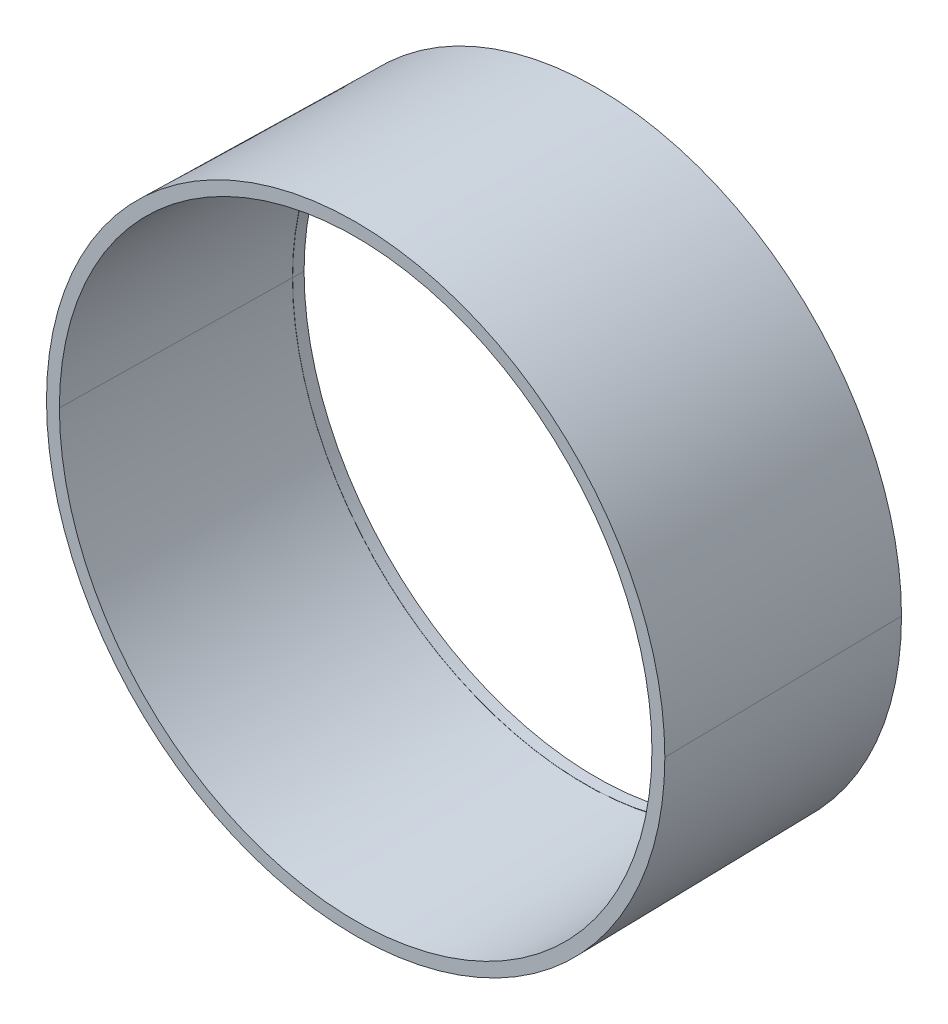
ISO-10303-21;
HEADER;
FILE_DESCRIPTION(('STEP AP214'),'2;1');
FILE_NAME('part.step','',(''),(''),'','','');
FILE_SCHEMA(('AUTOMOTIVE_DESIGN { 1 0 10303 214 1 1 1 1 }'));
ENDSEC;
DATA;
#1=APPLICATION_CONTEXT('core data for automotive mechanical design processes');
#2=APPLICATION_PROTOCOL_DEFINITION('international standard','automotive_design',2000,#1);
#3=PRODUCT_CONTEXT('',#1,'mechanical');
#4=PRODUCT('Part','Part','',(#3));
#5=PRODUCT_RELATED_PRODUCT_CATEGORY('part','',(#4));
#6=PRODUCT_DEFINITION_FORMATION('','',#4);
#7=PRODUCT_DEFINITION_CONTEXT('part definition',#1,'design');
#8=PRODUCT_DEFINITION('design','',#6,#7);
#9=PRODUCT_DEFINITION_SHAPE('','',#8);
#10=(LENGTH_UNIT() NAMED_UNIT(*) SI_UNIT(.MILLI.,.METRE.));
#11=(NAMED_UNIT(*) PLANE_ANGLE_UNIT() SI_UNIT($,.RADIAN.));
#12=(NAMED_UNIT(*) SI_UNIT($,.STERADIAN.) SOLID_ANGLE_UNIT());
#13=UNCERTAINTY_MEASURE_WITH_UNIT(LENGTH_MEASURE(1.E-05),#10,'distance_accuracy_value','');
#14=(GEOMETRIC_REPRESENTATION_CONTEXT(3) GLOBAL_UNCERTAINTY_ASSIGNED_CONTEXT((#13)) GLOBAL_UNIT_ASSIGNED_CONTEXT((#10,
#11,#12)) REPRESENTATION_CONTEXT('',''));
#15=CARTESIAN_POINT('',(0.,0.,0.));
#16=DIRECTION('',(0.,0.,1.));
#17=DIRECTION('',(1.,0.,0.));
#18=AXIS2_PLACEMENT_3D('',#15,#16,#17);
#19=CARTESIAN_POINT('',(0.,0.,-39.9));
#20=DIRECTION('',(0.,0.,-1.));
#21=DIRECTION('',(1.,0.,0.));
#22=AXIS2_PLACEMENT_3D('',#19,#20,#21);
#23=CYLINDRICAL_SURFACE('',#22,51.);
#24=DIRECTION('',(0.,0.,-1.));
#25=VECTOR('',#24,1.);
#26=CARTESIAN_POINT('',(-51.,0.,-40.));
#27=LINE('',#26,#25);
#28=CARTESIAN_POINT('',(-51.,0.,-40.));
#29=VERTEX_POINT('',#28);
#30=CARTESIAN_POINT('',(-51.,0.,-42.));
#31=VERTEX_POINT('',#30);
#32=EDGE_CURVE('E79',#29,#31,#27,.T.);
#33=ORIENTED_EDGE('',*,*,#32,.F.);
#34=CARTESIAN_POINT('',(0.,0.,-40.));
#35=DIRECTION('',(0.,0.,1.));
#36=DIRECTION('',(-1.,0.,0.));
#37=AXIS2_PLACEMENT_3D('',#34,#35,#36);
#38=CIRCLE('',#37,51.);
#39=CARTESIAN_POINT('',(51.,0.,-40.));
#40=VERTEX_POINT('',#39);
#41=EDGE_CURVE('E107',#29,#40,#38,.T.);
#42=ORIENTED_EDGE('',*,*,#41,.T.);
#43=DIRECTION('',(0.,0.,-1.));
#44=VECTOR('',#43,1.);
#45=CARTESIAN_POINT('',(51.,0.,-40.));
#46=LINE('',#45,#44);
#47=CARTESIAN_POINT('',(51.,0.,-42.));
#48=VERTEX_POINT('',#47);
#49=EDGE_CURVE('E136',#40,#48,#46,.T.);
#50=ORIENTED_EDGE('',*,*,#49,.T.);
#51=CARTESIAN_POINT('',(0.,0.,-42.));
#52=DIRECTION('',(0.,0.,-1.));
#53=DIRECTION('',(1.,0.,0.));
#54=AXIS2_PLACEMENT_3D('',#51,#52,#53);
#55=CIRCLE('',#54,51.);
#56=EDGE_CURVE('E137',#48,#31,#55,.T.);
#57=ORIENTED_EDGE('',*,*,#56,.T.);
#58=EDGE_LOOP('',(#33,#42,#50,#57));
#59=FACE_BOUND('',#58,.T.);
#60=ADVANCED_FACE('F16',(#59),#23,.F.);
#61=CARTESIAN_POINT('',(0.,0.,-20.));
#62=DIRECTION('',(0.,0.,1.));
#63=DIRECTION('',(-1.,0.,0.));
#64=AXIS2_PLACEMENT_3D('',#61,#62,#63);
#65=CONICAL_SURFACE('',#64,51.36666666667,0.016665123713937);
#66=DIRECTION('',(0.01666435233399,0.,-0.9998611400396));
#67=VECTOR('',#66,1.);
#68=CARTESIAN_POINT('',(-51.7,0.,0.));
#69=LINE('',#68,#67);
#70=CARTESIAN_POINT('',(-51.7,0.,-1.367407764635E-12));
#71=VERTEX_POINT('',#70);
#72=CARTESIAN_POINT('',(-51.03333333333,0.,-40.));
#73=VERTEX_POINT('',#72);
#74=EDGE_CURVE('E114',#71,#73,#69,.T.);
#75=ORIENTED_EDGE('',*,*,#74,.F.);
#76=CARTESIAN_POINT('',(0.,0.,-1.364242052659E-12));
#77=DIRECTION('',(0.,0.,1.));
#78=DIRECTION('',(-1.,0.,0.));
#79=AXIS2_PLACEMENT_3D('',#76,#77,#78);
#80=CIRCLE('',#79,51.7);
#81=CARTESIAN_POINT('',(51.7,0.,-1.361076340684E-12));
#82=VERTEX_POINT('',#81);
#83=EDGE_CURVE('E11',#71,#82,#80,.T.);
#84=ORIENTED_EDGE('',*,*,#83,.T.);
#85=DIRECTION('',(-0.01666435233399,0.,-0.9998611400396));
#86=VECTOR('',#85,1.);
#87=CARTESIAN_POINT('',(51.7,0.,0.));
#88=LINE('',#87,#86);
#89=CARTESIAN_POINT('',(51.03333333333,0.,-40.));
#90=VERTEX_POINT('',#89);
#91=EDGE_CURVE('E113',#82,#90,#88,.T.);
#92=ORIENTED_EDGE('',*,*,#91,.T.);
#93=CARTESIAN_POINT('',(0.,0.,-40.));
#94=DIRECTION('',(0.,0.,-1.));
#95=DIRECTION('',(1.,0.,0.));
#96=AXIS2_PLACEMENT_3D('',#93,#94,#95);
#97=CIRCLE('',#96,51.03333333333);
#98=EDGE_CURVE('E91',#90,#73,#97,.T.);
#99=ORIENTED_EDGE('',*,*,#98,.T.);
#100=EDGE_LOOP('',(#75,#84,#92,#99));
#101=FACE_BOUND('',#100,.T.);
#102=ADVANCED_FACE('F117',(#101),#65,.F.);
#103=CARTESIAN_POINT('',(0.,0.,0.));
#104=DIRECTION('',(0.,0.,-1.));
#105=DIRECTION('',(0.,-1.,0.));
#106=AXIS2_PLACEMENT_3D('',#103,#104,#105);
#107=PLANE('',#106);
#108=ORIENTED_EDGE('',*,*,#83,.F.);
#109=CARTESIAN_POINT('',(0.,0.,-1.364242052659E-12));
#110=DIRECTION('',(0.,0.,-1.));
#111=DIRECTION('',(-1.,0.,0.));
#112=AXIS2_PLACEMENT_3D('',#109,#110,#111);
#113=CIRCLE('',#112,51.7);
#114=EDGE_CURVE('E119',#71,#82,#113,.T.);
#115=ORIENTED_EDGE('',*,*,#114,.T.);
#116=EDGE_LOOP('',(#108,#115));
#117=FACE_BOUND('',#116,.T.);
#118=CARTESIAN_POINT('',(0.,0.,-1.364242052659E-12));
#119=DIRECTION('',(0.,0.,-1.));
#120=DIRECTION('',(-1.,0.,0.));
#121=AXIS2_PLACEMENT_3D('',#118,#119,#120);
#122=CIRCLE('',#121,53.95);
#123=CARTESIAN_POINT('',(-53.95,0.,0.));
#124=VERTEX_POINT('',#123);
#125=CARTESIAN_POINT('',(53.95,0.,0.));
#126=VERTEX_POINT('',#125);
#127=EDGE_CURVE('E139',#124,#126,#122,.T.);
#128=ORIENTED_EDGE('',*,*,#127,.F.);
#129=CARTESIAN_POINT('',(0.,0.,-1.364242052659E-12));
#130=DIRECTION('',(0.,0.,1.));
#131=DIRECTION('',(-1.,0.,0.));
#132=AXIS2_PLACEMENT_3D('',#129,#130,#131);
#133=CIRCLE('',#132,53.95);
#134=EDGE_CURVE('E27',#124,#126,#133,.T.);
#135=ORIENTED_EDGE('',*,*,#134,.T.);
#136=EDGE_LOOP('',(#128,#135));
#137=FACE_BOUND('',#136,.T.);
#138=ADVANCED_FACE('F191',(#117,#137),#107,.F.);
#139=CARTESIAN_POINT('',(0.,0.,-21.));
#140=DIRECTION('',(0.,0.,1.));
#141=DIRECTION('',(-1.,0.,0.));
#142=AXIS2_PLACEMENT_3D('',#139,#140,#141);
#143=CONICAL_SURFACE('',#142,53.6,0.016665123713937);
#144=CARTESIAN_POINT('',(0.,0.,-42.));
#145=DIRECTION('',(0.,0.,1.));
#146=DIRECTION('',(-1.,0.,0.));
#147=AXIS2_PLACEMENT_3D('',#144,#145,#146);
#148=CIRCLE('',#147,53.25);
#149=CARTESIAN_POINT('',(-53.25,0.,-42.));
#150=VERTEX_POINT('',#149);
#151=CARTESIAN_POINT('',(53.25,0.,-42.));
#152=VERTEX_POINT('',#151);
#153=EDGE_CURVE('E158',#150,#152,#148,.T.);
#154=ORIENTED_EDGE('',*,*,#153,.T.);
#155=DIRECTION('',(0.01666435233399,0.,0.9998611400396));
#156=VECTOR('',#155,1.);
#157=CARTESIAN_POINT('',(53.25,0.,-42.));
#158=LINE('',#157,#156);
#159=EDGE_CURVE('E20',#152,#126,#158,.T.);
#160=ORIENTED_EDGE('',*,*,#159,.T.);
#161=ORIENTED_EDGE('',*,*,#134,.F.);
#162=DIRECTION('',(-0.01666435233399,0.,0.9998611400396));
#163=VECTOR('',#162,1.);
#164=CARTESIAN_POINT('',(-53.25,0.,-42.));
#165=LINE('',#164,#163);
#166=EDGE_CURVE('E68',#150,#124,#165,.T.);
#167=ORIENTED_EDGE('',*,*,#166,.F.);
#168=EDGE_LOOP('',(#154,#160,#161,#167));
#169=FACE_BOUND('',#168,.T.);
#170=ADVANCED_FACE('F195',(#169),#143,.T.);
#171=CARTESIAN_POINT('',(0.,0.,-21.));
#172=DIRECTION('',(0.,0.,1.));
#173=DIRECTION('',(-1.,0.,0.));
#174=AXIS2_PLACEMENT_3D('',#171,#172,#173);
#175=CONICAL_SURFACE('',#174,53.6,0.016665123713937);
#176=ORIENTED_EDGE('',*,*,#127,.T.);
#177=ORIENTED_EDGE('',*,*,#159,.F.);
#178=CARTESIAN_POINT('',(0.,0.,-42.));
#179=DIRECTION('',(0.,0.,-1.));
#180=DIRECTION('',(-1.,0.,0.));
#181=AXIS2_PLACEMENT_3D('',#178,#179,#180);
#182=CIRCLE('',#181,53.25);
#183=EDGE_CURVE('E140',#150,#152,#182,.T.);
#184=ORIENTED_EDGE('',*,*,#183,.F.);
#185=ORIENTED_EDGE('',*,*,#166,.T.);
#186=EDGE_LOOP('',(#176,#177,#184,#185));
#187=FACE_BOUND('',#186,.T.);
#188=ADVANCED_FACE('F199',(#187),#175,.T.);
#189=CARTESIAN_POINT('',(0.,0.,-42.));
#190=DIRECTION('',(0.,0.,-1.));
#191=DIRECTION('',(0.,-1.,0.));
#192=AXIS2_PLACEMENT_3D('',#189,#190,#191);
#193=PLANE('',#192);
#194=ORIENTED_EDGE('',*,*,#56,.F.);
#195=CARTESIAN_POINT('',(0.,0.,-42.));
#196=DIRECTION('',(0.,0.,-1.));
#197=DIRECTION('',(-1.,0.,0.));
#198=AXIS2_PLACEMENT_3D('',#195,#196,#197);
#199=CIRCLE('',#198,51.);
#200=EDGE_CURVE('E128',#31,#48,#199,.T.);
#201=ORIENTED_EDGE('',*,*,#200,.F.);
#202=EDGE_LOOP('',(#194,#201));
#203=FACE_BOUND('',#202,.T.);
#204=ORIENTED_EDGE('',*,*,#153,.F.);
#205=ORIENTED_EDGE('',*,*,#183,.T.);
#206=EDGE_LOOP('',(#204,#205));
#207=FACE_BOUND('',#206,.T.);
#208=ADVANCED_FACE('F185',(#203,#207),#193,.T.);
#209=CARTESIAN_POINT('',(0.,0.,-39.9));
#210=DIRECTION('',(0.,0.,-1.));
#211=DIRECTION('',(1.,0.,0.));
#212=AXIS2_PLACEMENT_3D('',#209,#210,#211);
#213=CYLINDRICAL_SURFACE('',#212,51.);
#214=ORIENTED_EDGE('',*,*,#49,.F.);
#215=CARTESIAN_POINT('',(0.,0.,-40.));
#216=DIRECTION('',(0.,0.,-1.));
#217=DIRECTION('',(-1.,0.,0.));
#218=AXIS2_PLACEMENT_3D('',#215,#216,#217);
#219=CIRCLE('',#218,51.);
#220=EDGE_CURVE('E133',#29,#40,#219,.T.);
#221=ORIENTED_EDGE('',*,*,#220,.F.);
#222=ORIENTED_EDGE('',*,*,#32,.T.);
#223=ORIENTED_EDGE('',*,*,#200,.T.);
#224=EDGE_LOOP('',(#214,#221,#222,#223));
#225=FACE_BOUND('',#224,.T.);
#226=ADVANCED_FACE('F173',(#225),#213,.F.);
#227=CARTESIAN_POINT('',(0.,0.,-40.));
#228=DIRECTION('',(0.,0.,-1.));
#229=DIRECTION('',(0.,-1.,0.));
#230=AXIS2_PLACEMENT_3D('',#227,#228,#229);
#231=PLANE('',#230);
#232=ORIENTED_EDGE('',*,*,#41,.F.);
#233=ORIENTED_EDGE('',*,*,#220,.T.);
#234=EDGE_LOOP('',(#232,#233));
#235=FACE_BOUND('',#234,.T.);
#236=ORIENTED_EDGE('',*,*,#98,.F.);
#237=CARTESIAN_POINT('',(0.,0.,-40.));
#238=DIRECTION('',(0.,0.,-1.));
#239=DIRECTION('',(-1.,0.,0.));
#240=AXIS2_PLACEMENT_3D('',#237,#238,#239);
#241=CIRCLE('',#240,51.03333333333);
#242=EDGE_CURVE('E104',#73,#90,#241,.T.);
#243=ORIENTED_EDGE('',*,*,#242,.F.);
#244=EDGE_LOOP('',(#236,#243));
#245=FACE_BOUND('',#244,.T.);
#246=ADVANCED_FACE('F18',(#235,#245),#231,.F.);
#247=CARTESIAN_POINT('',(0.,0.,-20.));
#248=DIRECTION('',(0.,0.,1.));
#249=DIRECTION('',(-1.,0.,0.));
#250=AXIS2_PLACEMENT_3D('',#247,#248,#249);
#251=CONICAL_SURFACE('',#250,51.36666666667,0.016665123713937);
#252=ORIENTED_EDGE('',*,*,#91,.F.);
#253=ORIENTED_EDGE('',*,*,#114,.F.);
#254=ORIENTED_EDGE('',*,*,#74,.T.);
#255=ORIENTED_EDGE('',*,*,#242,.T.);
#256=EDGE_LOOP('',(#252,#253,#254,#255));
#257=FACE_BOUND('',#256,.T.);
#258=ADVANCED_FACE('F111',(#257),#251,.F.);
#259=CLOSED_SHELL('',(#60,#102,#138,#170,#188,#208,#226,#246,#258));
#260=MANIFOLD_SOLID_BREP('B1',#259);
#261=ADVANCED_BREP_SHAPE_REPRESENTATION('',(#18,#260),#14);
#262=SHAPE_DEFINITION_REPRESENTATION(#9,#261);
ENDSEC;
END-ISO-10303-21;
